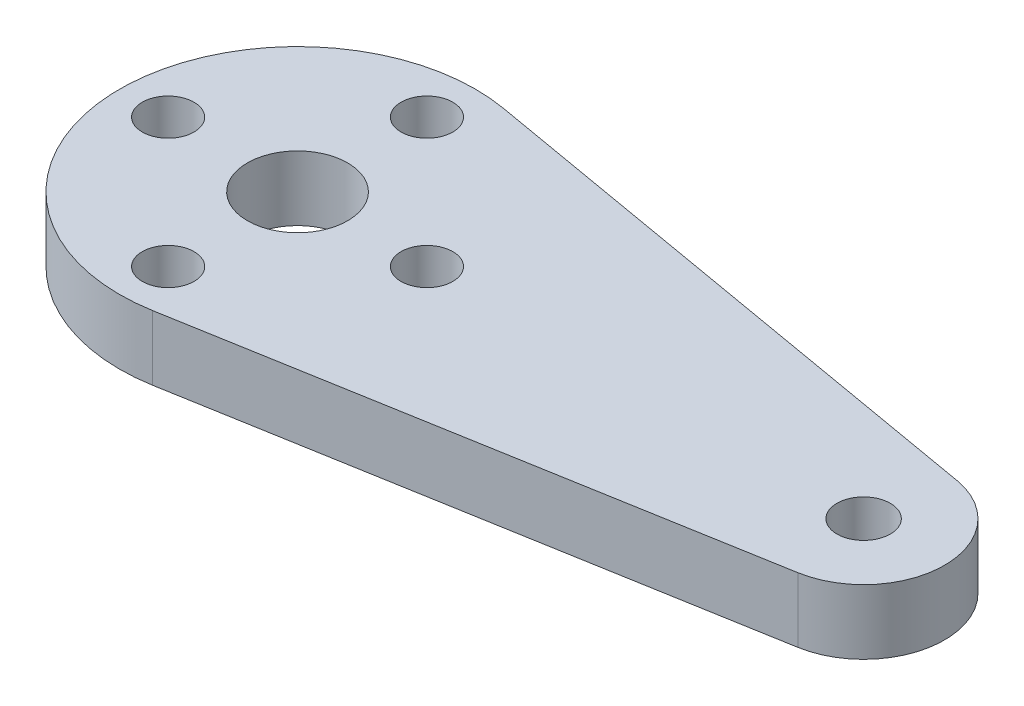
ISO-10303-21;
HEADER;
FILE_DESCRIPTION(('STEP AP214'),'2;1');
FILE_NAME('part.step','',(''),(''),'','','');
FILE_SCHEMA(('AUTOMOTIVE_DESIGN { 1 0 10303 214 1 1 1 1 }'));
ENDSEC;
DATA;
#1=APPLICATION_CONTEXT('core data for automotive mechanical design processes');
#2=APPLICATION_PROTOCOL_DEFINITION('international standard','automotive_design',2000,#1);
#3=PRODUCT_CONTEXT('',#1,'mechanical');
#4=PRODUCT('Part','Part','',(#3));
#5=PRODUCT_RELATED_PRODUCT_CATEGORY('part','',(#4));
#6=PRODUCT_DEFINITION_FORMATION('','',#4);
#7=PRODUCT_DEFINITION_CONTEXT('part definition',#1,'design');
#8=PRODUCT_DEFINITION('design','',#6,#7);
#9=PRODUCT_DEFINITION_SHAPE('','',#8);
#10=(LENGTH_UNIT() NAMED_UNIT(*) SI_UNIT(.MILLI.,.METRE.));
#11=(NAMED_UNIT(*) PLANE_ANGLE_UNIT() SI_UNIT($,.RADIAN.));
#12=(NAMED_UNIT(*) SI_UNIT($,.STERADIAN.) SOLID_ANGLE_UNIT());
#13=UNCERTAINTY_MEASURE_WITH_UNIT(LENGTH_MEASURE(1.E-05),#10,'distance_accuracy_value','');
#14=(GEOMETRIC_REPRESENTATION_CONTEXT(3) GLOBAL_UNCERTAINTY_ASSIGNED_CONTEXT((#13)) GLOBAL_UNIT_ASSIGNED_CONTEXT((#10,
#11,#12)) REPRESENTATION_CONTEXT('',''));
#15=CARTESIAN_POINT('',(0.,0.,0.));
#16=DIRECTION('',(0.,0.,1.));
#17=DIRECTION('',(1.,0.,0.));
#18=AXIS2_PLACEMENT_3D('',#15,#16,#17);
#19=CARTESIAN_POINT('',(19.6386228275357,4.,0.));
#20=DIRECTION('',(0.,-1.,0.));
#21=DIRECTION('',(0.,0.,-1.));
#22=AXIS2_PLACEMENT_3D('',#19,#20,#21);
#23=CYLINDRICAL_SURFACE('',#22,5.);
#24=CARTESIAN_POINT('',(19.6386228275357,0.,0.));
#25=DIRECTION('',(0.,1.,0.));
#26=DIRECTION('',(0.,0.,1.));
#27=AXIS2_PLACEMENT_3D('',#24,#25,#26);
#28=CIRCLE('',#27,5.);
#29=CARTESIAN_POINT('',(20.4957656846785,0.,4.92598275701905));
#30=VERTEX_POINT('',#29);
#31=CARTESIAN_POINT('',(20.4957656846785,0.,-4.92598275701905));
#32=VERTEX_POINT('',#31);
#33=EDGE_CURVE('E105',#30,#32,#28,.T.);
#34=ORIENTED_EDGE('',*,*,#33,.T.);
#35=DIRECTION('',(0.,-1.,0.));
#36=VECTOR('',#35,1.);
#37=CARTESIAN_POINT('',(20.4957656846785,4.,-4.92598275701905));
#38=LINE('',#37,#36);
#39=CARTESIAN_POINT('',(20.4957656846785,4.,-4.92598275701905));
#40=VERTEX_POINT('',#39);
#41=EDGE_CURVE('E11',#40,#32,#38,.T.);
#42=ORIENTED_EDGE('',*,*,#41,.F.);
#43=CARTESIAN_POINT('',(19.6386228275357,4.,0.));
#44=DIRECTION('',(0.,1.,0.));
#45=DIRECTION('',(0.,0.,1.));
#46=AXIS2_PLACEMENT_3D('',#43,#44,#45);
#47=CIRCLE('',#46,5.);
#48=CARTESIAN_POINT('',(20.4957656846785,4.,4.92598275701905));
#49=VERTEX_POINT('',#48);
#50=EDGE_CURVE('E83',#49,#40,#47,.T.);
#51=ORIENTED_EDGE('',*,*,#50,.F.);
#52=DIRECTION('',(0.,-1.,0.));
#53=VECTOR('',#52,1.);
#54=CARTESIAN_POINT('',(20.4957656846785,4.,4.92598275701905));
#55=LINE('',#54,#53);
#56=EDGE_CURVE('E104',#49,#30,#55,.T.);
#57=ORIENTED_EDGE('',*,*,#56,.T.);
#58=EDGE_LOOP('',(#34,#42,#51,#57));
#59=FACE_BOUND('',#58,.T.);
#60=ADVANCED_FACE('F41',(#59),#23,.T.);
#61=CARTESIAN_POINT('',(1.43427789533982,4.,-8.24276621142047));
#62=DIRECTION('',(0.171428571428571,0.,-0.98519655140381));
#63=DIRECTION('',(-0.98519655140381,0.,-0.171428571428571));
#64=AXIS2_PLACEMENT_3D('',#61,#62,#63);
#65=PLANE('',#64);
#66=DIRECTION('',(0.98519655140381,0.,0.171428571428571));
#67=VECTOR('',#66,1.);
#68=CARTESIAN_POINT('',(1.43427789533982,0.,-8.24276621142047));
#69=LINE('',#68,#67);
#70=CARTESIAN_POINT('',(-13.47566288675,0.,-10.8371620654419));
#71=VERTEX_POINT('',#70);
#72=EDGE_CURVE('E93',#71,#32,#69,.T.);
#73=ORIENTED_EDGE('',*,*,#72,.F.);
#74=DIRECTION('',(0.,-1.,0.));
#75=VECTOR('',#74,1.);
#76=CARTESIAN_POINT('',(-13.47566288675,4.,-10.8371620654419));
#77=LINE('',#76,#75);
#78=CARTESIAN_POINT('',(-13.47566288675,4.,-10.8371620654419));
#79=VERTEX_POINT('',#78);
#80=EDGE_CURVE('E49',#79,#71,#77,.T.);
#81=ORIENTED_EDGE('',*,*,#80,.F.);
#82=DIRECTION('',(0.98519655140381,0.,0.171428571428571));
#83=VECTOR('',#82,1.);
#84=CARTESIAN_POINT('',(1.43427789533982,4.,-8.24276621142047));
#85=LINE('',#84,#83);
#86=EDGE_CURVE('E91',#79,#40,#85,.T.);
#87=ORIENTED_EDGE('',*,*,#86,.T.);
#88=ORIENTED_EDGE('',*,*,#41,.T.);
#89=EDGE_LOOP('',(#73,#81,#87,#88));
#90=FACE_BOUND('',#89,.T.);
#91=ADVANCED_FACE('F90',(#90),#65,.T.);
#92=CARTESIAN_POINT('',(-15.3613771724643,4.,0.));
#93=DIRECTION('',(0.,-1.,0.));
#94=DIRECTION('',(0.,0.,-1.));
#95=AXIS2_PLACEMENT_3D('',#92,#93,#94);
#96=CYLINDRICAL_SURFACE('',#95,11.);
#97=CARTESIAN_POINT('',(-15.3613771724643,0.,0.));
#98=DIRECTION('',(0.,1.,0.));
#99=DIRECTION('',(0.,0.,1.));
#100=AXIS2_PLACEMENT_3D('',#97,#98,#99);
#101=CIRCLE('',#100,11.);
#102=CARTESIAN_POINT('',(-13.47566288675,0.,10.8371620654419));
#103=VERTEX_POINT('',#102);
#104=EDGE_CURVE('E72',#71,#103,#101,.T.);
#105=ORIENTED_EDGE('',*,*,#104,.T.);
#106=DIRECTION('',(0.,-1.,0.));
#107=VECTOR('',#106,1.);
#108=CARTESIAN_POINT('',(-13.47566288675,4.,10.8371620654419));
#109=LINE('',#108,#107);
#110=CARTESIAN_POINT('',(-13.47566288675,4.,10.8371620654419));
#111=VERTEX_POINT('',#110);
#112=EDGE_CURVE('E94',#111,#103,#109,.T.);
#113=ORIENTED_EDGE('',*,*,#112,.F.);
#114=CARTESIAN_POINT('',(-15.3613771724643,4.,0.));
#115=DIRECTION('',(0.,1.,0.));
#116=DIRECTION('',(0.,0.,1.));
#117=AXIS2_PLACEMENT_3D('',#114,#115,#116);
#118=CIRCLE('',#117,11.);
#119=EDGE_CURVE('E95',#79,#111,#118,.T.);
#120=ORIENTED_EDGE('',*,*,#119,.F.);
#121=ORIENTED_EDGE('',*,*,#80,.T.);
#122=EDGE_LOOP('',(#105,#113,#120,#121));
#123=FACE_BOUND('',#122,.T.);
#124=ADVANCED_FACE('F96',(#123),#96,.T.);
#125=CARTESIAN_POINT('',(1.43427789533982,4.,8.24276621142047));
#126=DIRECTION('',(-0.171428571428571,0.,-0.98519655140381));
#127=DIRECTION('',(-0.98519655140381,0.,0.171428571428571));
#128=AXIS2_PLACEMENT_3D('',#125,#126,#127);
#129=PLANE('',#128);
#130=DIRECTION('',(0.98519655140381,0.,-0.171428571428571));
#131=VECTOR('',#130,1.);
#132=CARTESIAN_POINT('',(1.43427789533982,0.,8.24276621142047));
#133=LINE('',#132,#131);
#134=EDGE_CURVE('E78',#103,#30,#133,.T.);
#135=ORIENTED_EDGE('',*,*,#134,.T.);
#136=ORIENTED_EDGE('',*,*,#56,.F.);
#137=DIRECTION('',(0.98519655140381,0.,-0.171428571428571));
#138=VECTOR('',#137,1.);
#139=CARTESIAN_POINT('',(1.43427789533982,4.,8.24276621142047));
#140=LINE('',#139,#138);
#141=EDGE_CURVE('E57',#111,#49,#140,.T.);
#142=ORIENTED_EDGE('',*,*,#141,.F.);
#143=ORIENTED_EDGE('',*,*,#112,.T.);
#144=EDGE_LOOP('',(#135,#136,#142,#143));
#145=FACE_BOUND('',#144,.T.);
#146=ADVANCED_FACE('F113',(#145),#129,.F.);
#147=CARTESIAN_POINT('',(0.,4.,0.));
#148=DIRECTION('',(0.,1.,0.));
#149=DIRECTION('',(0.,0.,1.));
#150=AXIS2_PLACEMENT_3D('',#147,#148,#149);
#151=PLANE('',#150);
#152=CARTESIAN_POINT('',(19.6386228275357,4.,0.));
#153=DIRECTION('',(0.,1.,0.));
#154=DIRECTION('',(0.,0.,1.));
#155=AXIS2_PLACEMENT_3D('',#152,#153,#154);
#156=CIRCLE('',#155,1.65);
#157=CARTESIAN_POINT('',(19.6386228275357,4.,1.65));
#158=VERTEX_POINT('',#157);
#159=EDGE_CURVE('E181',#158,#158,#156,.T.);
#160=ORIENTED_EDGE('',*,*,#159,.F.);
#161=EDGE_LOOP('',(#160));
#162=FACE_BOUND('',#161,.T.);
#163=CARTESIAN_POINT('',(-23.3613750700607,4.,-8.88102438817183E-05));
#164=DIRECTION('',(0.,1.,0.));
#165=DIRECTION('',(0.,0.,1.));
#166=AXIS2_PLACEMENT_3D('',#163,#164,#165);
#167=CIRCLE('',#166,1.6);
#168=CARTESIAN_POINT('',(-23.3613750700607,4.,1.59991118975612));
#169=VERTEX_POINT('',#168);
#170=EDGE_CURVE('E182',#169,#169,#167,.T.);
#171=ORIENTED_EDGE('',*,*,#170,.F.);
#172=EDGE_LOOP('',(#171));
#173=FACE_BOUND('',#172,.T.);
#174=CARTESIAN_POINT('',(-15.3613750700607,4.,-8.00008881024388));
#175=DIRECTION('',(0.,1.,0.));
#176=DIRECTION('',(0.,0.,1.));
#177=AXIS2_PLACEMENT_3D('',#174,#175,#176);
#178=CIRCLE('',#177,1.6);
#179=CARTESIAN_POINT('',(-15.3613750700607,4.,-6.40008881024388));
#180=VERTEX_POINT('',#179);
#181=EDGE_CURVE('E171',#180,#180,#178,.T.);
#182=ORIENTED_EDGE('',*,*,#181,.F.);
#183=EDGE_LOOP('',(#182));
#184=FACE_BOUND('',#183,.T.);
#185=CARTESIAN_POINT('',(-7.36137507006068,4.,-8.88102438826981E-05));
#186=DIRECTION('',(0.,1.,0.));
#187=DIRECTION('',(0.,0.,1.));
#188=AXIS2_PLACEMENT_3D('',#185,#186,#187);
#189=CIRCLE('',#188,1.6);
#190=CARTESIAN_POINT('',(-7.36137507006068,4.,1.59991118975612));
#191=VERTEX_POINT('',#190);
#192=EDGE_CURVE('E166',#191,#191,#189,.T.);
#193=ORIENTED_EDGE('',*,*,#192,.F.);
#194=EDGE_LOOP('',(#193));
#195=FACE_BOUND('',#194,.T.);
#196=CARTESIAN_POINT('',(-15.3613750700607,4.,7.99991118975612));
#197=DIRECTION('',(0.,1.,0.));
#198=DIRECTION('',(0.,0.,1.));
#199=AXIS2_PLACEMENT_3D('',#196,#197,#198);
#200=CIRCLE('',#199,1.6);
#201=CARTESIAN_POINT('',(-15.3613750700607,4.,9.59991118975612));
#202=VERTEX_POINT('',#201);
#203=EDGE_CURVE('E173',#202,#202,#200,.T.);
#204=ORIENTED_EDGE('',*,*,#203,.F.);
#205=EDGE_LOOP('',(#204));
#206=FACE_BOUND('',#205,.T.);
#207=CARTESIAN_POINT('',(-15.3613750700607,4.,-8.8810243882698E-05));
#208=DIRECTION('',(0.,1.,0.));
#209=DIRECTION('',(0.,0.,1.));
#210=AXIS2_PLACEMENT_3D('',#207,#208,#209);
#211=CIRCLE('',#210,3.1);
#212=CARTESIAN_POINT('',(-15.3613750700607,4.,3.09991118975612));
#213=VERTEX_POINT('',#212);
#214=EDGE_CURVE('E185',#213,#213,#211,.T.);
#215=ORIENTED_EDGE('',*,*,#214,.F.);
#216=EDGE_LOOP('',(#215));
#217=FACE_BOUND('',#216,.T.);
#218=ORIENTED_EDGE('',*,*,#50,.T.);
#219=ORIENTED_EDGE('',*,*,#86,.F.);
#220=ORIENTED_EDGE('',*,*,#119,.T.);
#221=ORIENTED_EDGE('',*,*,#141,.T.);
#222=EDGE_LOOP('',(#218,#219,#220,#221));
#223=FACE_BOUND('',#222,.T.);
#224=ADVANCED_FACE('F98',(#162,#173,#184,#195,#206,#217,#223),#151,.T.);
#225=CARTESIAN_POINT('',(0.,0.,0.));
#226=DIRECTION('',(0.,1.,0.));
#227=DIRECTION('',(0.,0.,1.));
#228=AXIS2_PLACEMENT_3D('',#225,#226,#227);
#229=PLANE('',#228);
#230=CARTESIAN_POINT('',(19.6386228275357,0.,0.));
#231=DIRECTION('',(0.,1.,0.));
#232=DIRECTION('',(0.,0.,1.));
#233=AXIS2_PLACEMENT_3D('',#230,#231,#232);
#234=CIRCLE('',#233,1.65);
#235=CARTESIAN_POINT('',(19.6386228275357,0.,1.65));
#236=VERTEX_POINT('',#235);
#237=EDGE_CURVE('E193',#236,#236,#234,.T.);
#238=ORIENTED_EDGE('',*,*,#237,.T.);
#239=EDGE_LOOP('',(#238));
#240=FACE_BOUND('',#239,.T.);
#241=CARTESIAN_POINT('',(-23.3613750700607,0.,-8.88102438817183E-05));
#242=DIRECTION('',(0.,1.,0.));
#243=DIRECTION('',(0.,0.,1.));
#244=AXIS2_PLACEMENT_3D('',#241,#242,#243);
#245=CIRCLE('',#244,1.6);
#246=CARTESIAN_POINT('',(-23.3613750700607,0.,1.59991118975612));
#247=VERTEX_POINT('',#246);
#248=EDGE_CURVE('E186',#247,#247,#245,.T.);
#249=ORIENTED_EDGE('',*,*,#248,.T.);
#250=EDGE_LOOP('',(#249));
#251=FACE_BOUND('',#250,.T.);
#252=CARTESIAN_POINT('',(-15.3613750700607,0.,-8.00008881024388));
#253=DIRECTION('',(0.,1.,0.));
#254=DIRECTION('',(0.,0.,1.));
#255=AXIS2_PLACEMENT_3D('',#252,#253,#254);
#256=CIRCLE('',#255,1.6);
#257=CARTESIAN_POINT('',(-15.3613750700607,0.,-6.40008881024388));
#258=VERTEX_POINT('',#257);
#259=EDGE_CURVE('E168',#258,#258,#256,.T.);
#260=ORIENTED_EDGE('',*,*,#259,.T.);
#261=EDGE_LOOP('',(#260));
#262=FACE_BOUND('',#261,.T.);
#263=CARTESIAN_POINT('',(-7.36137507006068,0.,-8.88102438826981E-05));
#264=DIRECTION('',(0.,1.,0.));
#265=DIRECTION('',(0.,0.,1.));
#266=AXIS2_PLACEMENT_3D('',#263,#264,#265);
#267=CIRCLE('',#266,1.6);
#268=CARTESIAN_POINT('',(-7.36137507006068,0.,1.59991118975612));
#269=VERTEX_POINT('',#268);
#270=EDGE_CURVE('E163',#269,#269,#267,.T.);
#271=ORIENTED_EDGE('',*,*,#270,.T.);
#272=EDGE_LOOP('',(#271));
#273=FACE_BOUND('',#272,.T.);
#274=CARTESIAN_POINT('',(-15.3613750700607,0.,7.99991118975612));
#275=DIRECTION('',(0.,1.,0.));
#276=DIRECTION('',(0.,0.,1.));
#277=AXIS2_PLACEMENT_3D('',#274,#275,#276);
#278=CIRCLE('',#277,1.6);
#279=CARTESIAN_POINT('',(-15.3613750700607,0.,9.59991118975612));
#280=VERTEX_POINT('',#279);
#281=EDGE_CURVE('E178',#280,#280,#278,.T.);
#282=ORIENTED_EDGE('',*,*,#281,.T.);
#283=EDGE_LOOP('',(#282));
#284=FACE_BOUND('',#283,.T.);
#285=CARTESIAN_POINT('',(-15.3613750700607,0.,-8.8810243882698E-05));
#286=DIRECTION('',(0.,1.,0.));
#287=DIRECTION('',(0.,0.,1.));
#288=AXIS2_PLACEMENT_3D('',#285,#286,#287);
#289=CIRCLE('',#288,3.1);
#290=CARTESIAN_POINT('',(-15.3613750700607,0.,3.09991118975612));
#291=VERTEX_POINT('',#290);
#292=EDGE_CURVE('E108',#291,#291,#289,.T.);
#293=ORIENTED_EDGE('',*,*,#292,.T.);
#294=EDGE_LOOP('',(#293));
#295=FACE_BOUND('',#294,.T.);
#296=ORIENTED_EDGE('',*,*,#33,.F.);
#297=ORIENTED_EDGE('',*,*,#134,.F.);
#298=ORIENTED_EDGE('',*,*,#104,.F.);
#299=ORIENTED_EDGE('',*,*,#72,.T.);
#300=EDGE_LOOP('',(#296,#297,#298,#299));
#301=FACE_BOUND('',#300,.T.);
#302=ADVANCED_FACE('F116',(#240,#251,#262,#273,#284,#295,#301),#229,.F.);
#303=CARTESIAN_POINT('',(-15.3613750700607,0.,-8.8810243882698E-05));
#304=DIRECTION('',(0.,1.,0.));
#305=DIRECTION('',(0.,0.,1.));
#306=AXIS2_PLACEMENT_3D('',#303,#304,#305);
#307=CYLINDRICAL_SURFACE('',#306,3.1);
#308=ORIENTED_EDGE('',*,*,#292,.F.);
#309=EDGE_LOOP('',(#308));
#310=FACE_BOUND('',#309,.T.);
#311=ORIENTED_EDGE('',*,*,#214,.T.);
#312=EDGE_LOOP('',(#311));
#313=FACE_BOUND('',#312,.T.);
#314=ADVANCED_FACE('F131',(#310,#313),#307,.F.);
#315=CARTESIAN_POINT('',(-15.3613750700607,0.,7.99991118975612));
#316=DIRECTION('',(0.,1.,0.));
#317=DIRECTION('',(0.,0.,1.));
#318=AXIS2_PLACEMENT_3D('',#315,#316,#317);
#319=CYLINDRICAL_SURFACE('',#318,1.6);
#320=ORIENTED_EDGE('',*,*,#281,.F.);
#321=EDGE_LOOP('',(#320));
#322=FACE_BOUND('',#321,.T.);
#323=ORIENTED_EDGE('',*,*,#203,.T.);
#324=EDGE_LOOP('',(#323));
#325=FACE_BOUND('',#324,.T.);
#326=ADVANCED_FACE('F138',(#322,#325),#319,.F.);
#327=CARTESIAN_POINT('',(-7.36137507006068,0.,-8.88102438826981E-05));
#328=DIRECTION('',(0.,1.,0.));
#329=DIRECTION('',(0.,0.,1.));
#330=AXIS2_PLACEMENT_3D('',#327,#328,#329);
#331=CYLINDRICAL_SURFACE('',#330,1.6);
#332=ORIENTED_EDGE('',*,*,#270,.F.);
#333=EDGE_LOOP('',(#332));
#334=FACE_BOUND('',#333,.T.);
#335=ORIENTED_EDGE('',*,*,#192,.T.);
#336=EDGE_LOOP('',(#335));
#337=FACE_BOUND('',#336,.T.);
#338=ADVANCED_FACE('F148',(#334,#337),#331,.F.);
#339=CARTESIAN_POINT('',(-15.3613750700607,0.,-8.00008881024388));
#340=DIRECTION('',(0.,1.,0.));
#341=DIRECTION('',(0.,0.,1.));
#342=AXIS2_PLACEMENT_3D('',#339,#340,#341);
#343=CYLINDRICAL_SURFACE('',#342,1.6);
#344=ORIENTED_EDGE('',*,*,#259,.F.);
#345=EDGE_LOOP('',(#344));
#346=FACE_BOUND('',#345,.T.);
#347=ORIENTED_EDGE('',*,*,#181,.T.);
#348=EDGE_LOOP('',(#347));
#349=FACE_BOUND('',#348,.T.);
#350=ADVANCED_FACE('F145',(#346,#349),#343,.F.);
#351=CARTESIAN_POINT('',(-23.3613750700607,0.,-8.88102438817183E-05));
#352=DIRECTION('',(0.,1.,0.));
#353=DIRECTION('',(0.,0.,1.));
#354=AXIS2_PLACEMENT_3D('',#351,#352,#353);
#355=CYLINDRICAL_SURFACE('',#354,1.6);
#356=ORIENTED_EDGE('',*,*,#248,.F.);
#357=EDGE_LOOP('',(#356));
#358=FACE_BOUND('',#357,.T.);
#359=ORIENTED_EDGE('',*,*,#170,.T.);
#360=EDGE_LOOP('',(#359));
#361=FACE_BOUND('',#360,.T.);
#362=ADVANCED_FACE('F143',(#358,#361),#355,.F.);
#363=CARTESIAN_POINT('',(19.6386228275357,0.,0.));
#364=DIRECTION('',(0.,1.,0.));
#365=DIRECTION('',(0.,0.,1.));
#366=AXIS2_PLACEMENT_3D('',#363,#364,#365);
#367=CYLINDRICAL_SURFACE('',#366,1.65);
#368=ORIENTED_EDGE('',*,*,#237,.F.);
#369=EDGE_LOOP('',(#368));
#370=FACE_BOUND('',#369,.T.);
#371=ORIENTED_EDGE('',*,*,#159,.T.);
#372=EDGE_LOOP('',(#371));
#373=FACE_BOUND('',#372,.T.);
#374=ADVANCED_FACE('F140',(#370,#373),#367,.F.);
#375=CLOSED_SHELL('',(#60,#91,#124,#146,#224,#302,#314,#326,#338,#350,#362,#374));
#376=MANIFOLD_SOLID_BREP('B2',#375);
#377=ADVANCED_BREP_SHAPE_REPRESENTATION('',(#18,#376),#14);
#378=SHAPE_DEFINITION_REPRESENTATION(#9,#377);
ENDSEC;
END-ISO-10303-21;
